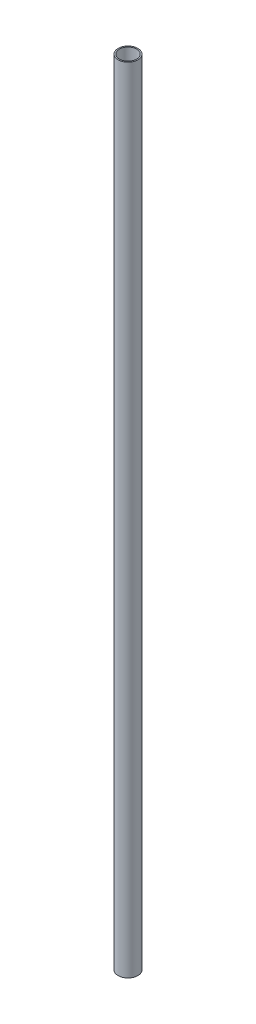
ISO-10303-21;
HEADER;
FILE_DESCRIPTION(('STEP AP214'),'2;1');
FILE_NAME('part.step','',(''),(''),'','','');
FILE_SCHEMA(('AUTOMOTIVE_DESIGN { 1 0 10303 214 1 1 1 1 }'));
ENDSEC;
DATA;
#1=APPLICATION_CONTEXT('core data for automotive mechanical design processes');
#2=APPLICATION_PROTOCOL_DEFINITION('international standard','automotive_design',2000,#1);
#3=PRODUCT_CONTEXT('',#1,'mechanical');
#4=PRODUCT('Part','Part','',(#3));
#5=PRODUCT_RELATED_PRODUCT_CATEGORY('part','',(#4));
#6=PRODUCT_DEFINITION_FORMATION('','',#4);
#7=PRODUCT_DEFINITION_CONTEXT('part definition',#1,'design');
#8=PRODUCT_DEFINITION('design','',#6,#7);
#9=PRODUCT_DEFINITION_SHAPE('','',#8);
#10=(LENGTH_UNIT() NAMED_UNIT(*) SI_UNIT(.MILLI.,.METRE.));
#11=(NAMED_UNIT(*) PLANE_ANGLE_UNIT() SI_UNIT($,.RADIAN.));
#12=(NAMED_UNIT(*) SI_UNIT($,.STERADIAN.) SOLID_ANGLE_UNIT());
#13=UNCERTAINTY_MEASURE_WITH_UNIT(LENGTH_MEASURE(1.E-05),#10,'distance_accuracy_value','');
#14=(GEOMETRIC_REPRESENTATION_CONTEXT(3) GLOBAL_UNCERTAINTY_ASSIGNED_CONTEXT((#13)) GLOBAL_UNIT_ASSIGNED_CONTEXT((#10,
#11,#12)) REPRESENTATION_CONTEXT('',''));
#15=CARTESIAN_POINT('',(0.,0.,0.));
#16=DIRECTION('',(0.,0.,1.));
#17=DIRECTION('',(1.,0.,0.));
#18=AXIS2_PLACEMENT_3D('',#15,#16,#17);
#19=CARTESIAN_POINT('',(0.,641.,0.));
#20=DIRECTION('',(0.,1.,0.));
#21=DIRECTION('',(0.,0.,1.));
#22=AXIS2_PLACEMENT_3D('',#19,#20,#21);
#23=PLANE('',#22);
#24=CARTESIAN_POINT('',(0.,641.,0.));
#25=DIRECTION('',(0.,1.,0.));
#26=DIRECTION('',(0.,0.,1.));
#27=AXIS2_PLACEMENT_3D('',#24,#25,#26);
#28=CIRCLE('',#27,8.);
#29=CARTESIAN_POINT('',(0.,641.,8.));
#30=VERTEX_POINT('',#29);
#31=EDGE_CURVE('E10',#30,#30,#28,.T.);
#32=ORIENTED_EDGE('',*,*,#31,.T.);
#33=EDGE_LOOP('',(#32));
#34=FACE_BOUND('',#33,.T.);
#35=CARTESIAN_POINT('',(0.,641.,0.));
#36=DIRECTION('',(0.,1.,0.));
#37=DIRECTION('',(0.,0.,1.));
#38=AXIS2_PLACEMENT_3D('',#35,#36,#37);
#39=CIRCLE('',#38,7.);
#40=CARTESIAN_POINT('',(0.,641.,7.));
#41=VERTEX_POINT('',#40);
#42=EDGE_CURVE('E44',#41,#41,#39,.T.);
#43=ORIENTED_EDGE('',*,*,#42,.F.);
#44=EDGE_LOOP('',(#43));
#45=FACE_BOUND('',#44,.T.);
#46=ADVANCED_FACE('F33',(#34,#45),#23,.T.);
#47=CARTESIAN_POINT('',(0.,0.,0.));
#48=DIRECTION('',(0.,1.,0.));
#49=DIRECTION('',(0.,0.,1.));
#50=AXIS2_PLACEMENT_3D('',#47,#48,#49);
#51=PLANE('',#50);
#52=CARTESIAN_POINT('',(0.,0.,0.));
#53=DIRECTION('',(0.,1.,0.));
#54=DIRECTION('',(0.,0.,1.));
#55=AXIS2_PLACEMENT_3D('',#52,#53,#54);
#56=CIRCLE('',#55,8.);
#57=CARTESIAN_POINT('',(0.,0.,8.));
#58=VERTEX_POINT('',#57);
#59=EDGE_CURVE('E37',#58,#58,#56,.T.);
#60=ORIENTED_EDGE('',*,*,#59,.F.);
#61=EDGE_LOOP('',(#60));
#62=FACE_BOUND('',#61,.T.);
#63=CARTESIAN_POINT('',(0.,0.,0.));
#64=DIRECTION('',(0.,1.,0.));
#65=DIRECTION('',(0.,0.,1.));
#66=AXIS2_PLACEMENT_3D('',#63,#64,#65);
#67=CIRCLE('',#66,7.);
#68=CARTESIAN_POINT('',(0.,0.,7.));
#69=VERTEX_POINT('',#68);
#70=EDGE_CURVE('E46',#69,#69,#67,.T.);
#71=ORIENTED_EDGE('',*,*,#70,.T.);
#72=EDGE_LOOP('',(#71));
#73=FACE_BOUND('',#72,.T.);
#74=ADVANCED_FACE('F56',(#62,#73),#51,.F.);
#75=CARTESIAN_POINT('',(0.,641.,0.));
#76=DIRECTION('',(0.,-1.,0.));
#77=DIRECTION('',(0.,0.,-1.));
#78=AXIS2_PLACEMENT_3D('',#75,#76,#77);
#79=CYLINDRICAL_SURFACE('',#78,8.);
#80=ORIENTED_EDGE('',*,*,#31,.F.);
#81=EDGE_LOOP('',(#80));
#82=FACE_BOUND('',#81,.T.);
#83=ORIENTED_EDGE('',*,*,#59,.T.);
#84=EDGE_LOOP('',(#83));
#85=FACE_BOUND('',#84,.T.);
#86=ADVANCED_FACE('F35',(#82,#85),#79,.T.);
#87=CARTESIAN_POINT('',(0.,641.,0.));
#88=DIRECTION('',(0.,-1.,0.));
#89=DIRECTION('',(0.,0.,-1.));
#90=AXIS2_PLACEMENT_3D('',#87,#88,#89);
#91=CYLINDRICAL_SURFACE('',#90,7.);
#92=ORIENTED_EDGE('',*,*,#42,.T.);
#93=EDGE_LOOP('',(#92));
#94=FACE_BOUND('',#93,.T.);
#95=ORIENTED_EDGE('',*,*,#70,.F.);
#96=EDGE_LOOP('',(#95));
#97=FACE_BOUND('',#96,.T.);
#98=ADVANCED_FACE('F52',(#94,#97),#91,.F.);
#99=CLOSED_SHELL('',(#46,#74,#86,#98));
#100=MANIFOLD_SOLID_BREP('B2',#99);
#101=ADVANCED_BREP_SHAPE_REPRESENTATION('',(#18,#100),#14);
#102=SHAPE_DEFINITION_REPRESENTATION(#9,#101);
ENDSEC;
END-ISO-10303-21;
